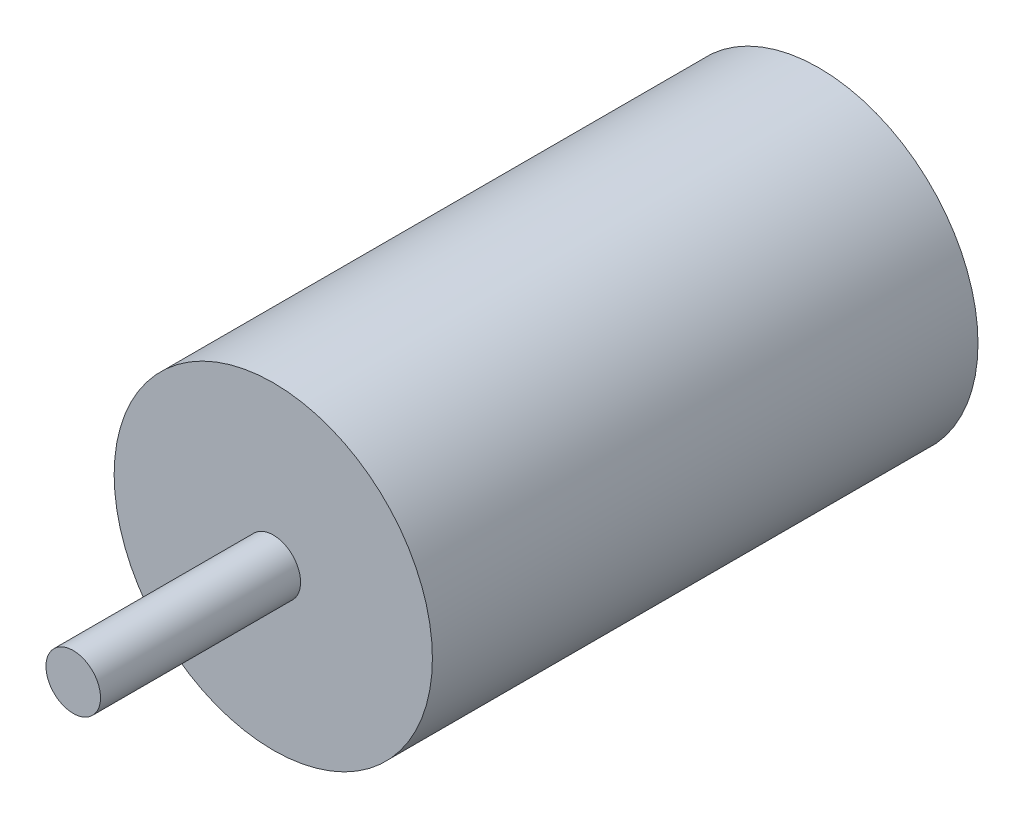
ISO-10303-21;
HEADER;
FILE_DESCRIPTION(('STEP AP214'),'2;1');
FILE_NAME('part.step','',(''),(''),'','','');
FILE_SCHEMA(('AUTOMOTIVE_DESIGN { 1 0 10303 214 1 1 1 1 }'));
ENDSEC;
DATA;
#1=APPLICATION_CONTEXT('core data for automotive mechanical design processes');
#2=APPLICATION_PROTOCOL_DEFINITION('international standard','automotive_design',2000,#1);
#3=PRODUCT_CONTEXT('',#1,'mechanical');
#4=PRODUCT('Part','Part','',(#3));
#5=PRODUCT_RELATED_PRODUCT_CATEGORY('part','',(#4));
#6=PRODUCT_DEFINITION_FORMATION('','',#4);
#7=PRODUCT_DEFINITION_CONTEXT('part definition',#1,'design');
#8=PRODUCT_DEFINITION('design','',#6,#7);
#9=PRODUCT_DEFINITION_SHAPE('','',#8);
#10=(LENGTH_UNIT() NAMED_UNIT(*) SI_UNIT(.MILLI.,.METRE.));
#11=(NAMED_UNIT(*) PLANE_ANGLE_UNIT() SI_UNIT($,.RADIAN.));
#12=(NAMED_UNIT(*) SI_UNIT($,.STERADIAN.) SOLID_ANGLE_UNIT());
#13=UNCERTAINTY_MEASURE_WITH_UNIT(LENGTH_MEASURE(1.E-05),#10,'distance_accuracy_value','');
#14=(GEOMETRIC_REPRESENTATION_CONTEXT(3) GLOBAL_UNCERTAINTY_ASSIGNED_CONTEXT((#13)) GLOBAL_UNIT_ASSIGNED_CONTEXT((#10,
#11,#12)) REPRESENTATION_CONTEXT('',''));
#15=CARTESIAN_POINT('',(0.,0.,0.));
#16=DIRECTION('',(0.,0.,1.));
#17=DIRECTION('',(1.,0.,0.));
#18=AXIS2_PLACEMENT_3D('',#15,#16,#17);
#19=CARTESIAN_POINT('',(0.,0.,60.));
#20=DIRECTION('',(0.,0.,-1.));
#21=DIRECTION('',(-1.,0.,0.));
#22=AXIS2_PLACEMENT_3D('',#19,#20,#21);
#23=CYLINDRICAL_SURFACE('',#22,17.5);
#24=CARTESIAN_POINT('',(0.,0.,60.));
#25=DIRECTION('',(0.,0.,1.));
#26=DIRECTION('',(1.,0.,0.));
#27=AXIS2_PLACEMENT_3D('',#24,#25,#26);
#28=CIRCLE('',#27,17.5);
#29=CARTESIAN_POINT('',(17.5,0.,60.));
#30=VERTEX_POINT('',#29);
#31=EDGE_CURVE('E38',#30,#30,#28,.T.);
#32=ORIENTED_EDGE('',*,*,#31,.F.);
#33=EDGE_LOOP('',(#32));
#34=FACE_BOUND('',#33,.T.);
#35=CARTESIAN_POINT('',(0.,0.,0.));
#36=DIRECTION('',(0.,0.,1.));
#37=DIRECTION('',(1.,0.,0.));
#38=AXIS2_PLACEMENT_3D('',#35,#36,#37);
#39=CIRCLE('',#38,17.5);
#40=CARTESIAN_POINT('',(17.5,0.,0.));
#41=VERTEX_POINT('',#40);
#42=EDGE_CURVE('E34',#41,#41,#39,.T.);
#43=ORIENTED_EDGE('',*,*,#42,.T.);
#44=EDGE_LOOP('',(#43));
#45=FACE_BOUND('',#44,.T.);
#46=ADVANCED_FACE('F31',(#34,#45),#23,.T.);
#47=CARTESIAN_POINT('',(0.,0.,60.));
#48=DIRECTION('',(0.,0.,1.));
#49=DIRECTION('',(1.,0.,0.));
#50=AXIS2_PLACEMENT_3D('',#47,#48,#49);
#51=PLANE('',#50);
#52=CARTESIAN_POINT('',(0.,0.,60.));
#53=DIRECTION('',(0.,0.,1.));
#54=DIRECTION('',(1.,0.,0.));
#55=AXIS2_PLACEMENT_3D('',#52,#53,#54);
#56=CIRCLE('',#55,3.);
#57=CARTESIAN_POINT('',(3.,0.,60.));
#58=VERTEX_POINT('',#57);
#59=EDGE_CURVE('E10',#58,#58,#56,.T.);
#60=ORIENTED_EDGE('',*,*,#59,.F.);
#61=EDGE_LOOP('',(#60));
#62=FACE_BOUND('',#61,.T.);
#63=ORIENTED_EDGE('',*,*,#31,.T.);
#64=EDGE_LOOP('',(#63));
#65=FACE_BOUND('',#64,.T.);
#66=ADVANCED_FACE('F55',(#62,#65),#51,.T.);
#67=CARTESIAN_POINT('',(0.,0.,0.));
#68=DIRECTION('',(0.,0.,1.));
#69=DIRECTION('',(1.,0.,0.));
#70=AXIS2_PLACEMENT_3D('',#67,#68,#69);
#71=PLANE('',#70);
#72=ORIENTED_EDGE('',*,*,#42,.F.);
#73=EDGE_LOOP('',(#72));
#74=FACE_BOUND('',#73,.T.);
#75=ADVANCED_FACE('F52',(#74),#71,.F.);
#76=CARTESIAN_POINT('',(0.,0.,82.));
#77=DIRECTION('',(0.,0.,-1.));
#78=DIRECTION('',(-1.,0.,0.));
#79=AXIS2_PLACEMENT_3D('',#76,#77,#78);
#80=CYLINDRICAL_SURFACE('',#79,3.);
#81=CARTESIAN_POINT('',(0.,0.,82.));
#82=DIRECTION('',(0.,0.,1.));
#83=DIRECTION('',(1.,0.,0.));
#84=AXIS2_PLACEMENT_3D('',#81,#82,#83);
#85=CIRCLE('',#84,3.);
#86=CARTESIAN_POINT('',(3.,0.,82.));
#87=VERTEX_POINT('',#86);
#88=EDGE_CURVE('E44',#87,#87,#85,.T.);
#89=ORIENTED_EDGE('',*,*,#88,.F.);
#90=EDGE_LOOP('',(#89));
#91=FACE_BOUND('',#90,.T.);
#92=ORIENTED_EDGE('',*,*,#59,.T.);
#93=EDGE_LOOP('',(#92));
#94=FACE_BOUND('',#93,.T.);
#95=ADVANCED_FACE('F54',(#91,#94),#80,.T.);
#96=CARTESIAN_POINT('',(0.,0.,82.));
#97=DIRECTION('',(0.,0.,1.));
#98=DIRECTION('',(1.,0.,0.));
#99=AXIS2_PLACEMENT_3D('',#96,#97,#98);
#100=PLANE('',#99);
#101=ORIENTED_EDGE('',*,*,#88,.T.);
#102=EDGE_LOOP('',(#101));
#103=FACE_BOUND('',#102,.T.);
#104=ADVANCED_FACE('F60',(#103),#100,.T.);
#105=CLOSED_SHELL('',(#46,#66,#75,#95,#104));
#106=MANIFOLD_SOLID_BREP('B2',#105);
#107=ADVANCED_BREP_SHAPE_REPRESENTATION('',(#18,#106),#14);
#108=SHAPE_DEFINITION_REPRESENTATION(#9,#107);
ENDSEC;
END-ISO-10303-21;
